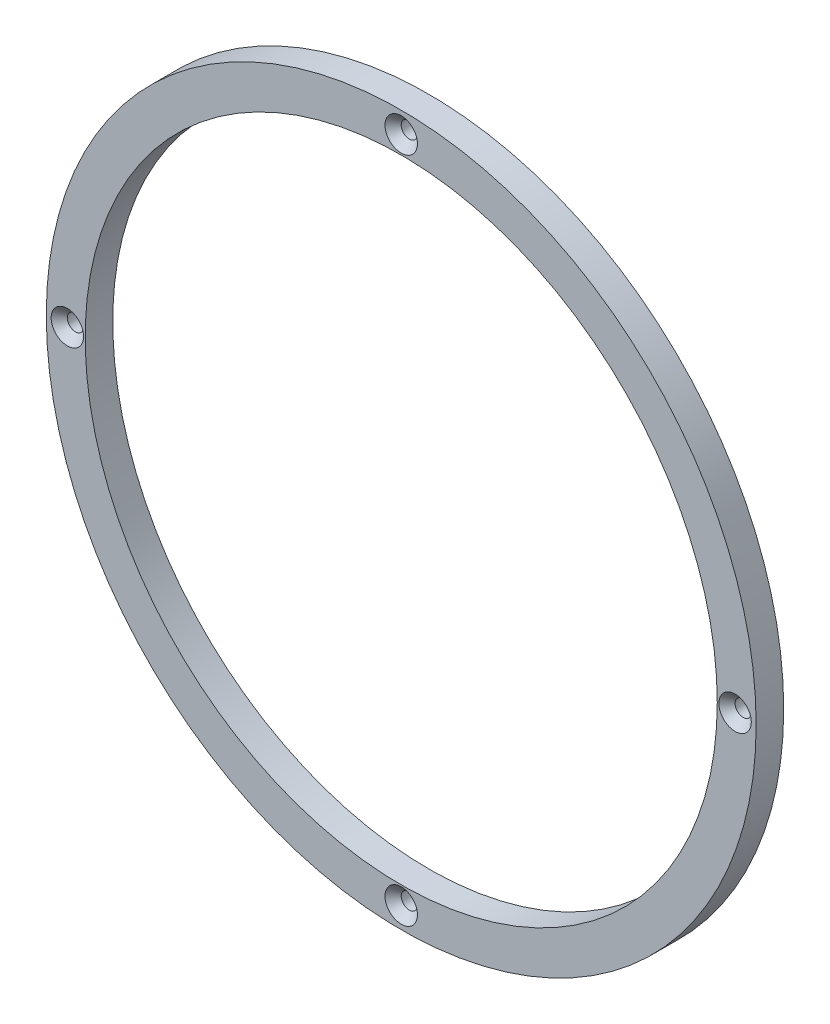
ISO-10303-21;
HEADER;
FILE_DESCRIPTION(('STEP AP214'),'2;1');
FILE_NAME('part.step','',(''),(''),'','','');
FILE_SCHEMA(('AUTOMOTIVE_DESIGN { 1 0 10303 214 1 1 1 1 }'));
ENDSEC;
DATA;
#1=APPLICATION_CONTEXT('core data for automotive mechanical design processes');
#2=APPLICATION_PROTOCOL_DEFINITION('international standard','automotive_design',2000,#1);
#3=PRODUCT_CONTEXT('',#1,'mechanical');
#4=PRODUCT('Part','Part','',(#3));
#5=PRODUCT_RELATED_PRODUCT_CATEGORY('part','',(#4));
#6=PRODUCT_DEFINITION_FORMATION('','',#4);
#7=PRODUCT_DEFINITION_CONTEXT('part definition',#1,'design');
#8=PRODUCT_DEFINITION('design','',#6,#7);
#9=PRODUCT_DEFINITION_SHAPE('','',#8);
#10=(LENGTH_UNIT() NAMED_UNIT(*) SI_UNIT(.MILLI.,.METRE.));
#11=(NAMED_UNIT(*) PLANE_ANGLE_UNIT() SI_UNIT($,.RADIAN.));
#12=(NAMED_UNIT(*) SI_UNIT($,.STERADIAN.) SOLID_ANGLE_UNIT());
#13=UNCERTAINTY_MEASURE_WITH_UNIT(LENGTH_MEASURE(1.E-05),#10,'distance_accuracy_value','');
#14=(GEOMETRIC_REPRESENTATION_CONTEXT(3) GLOBAL_UNCERTAINTY_ASSIGNED_CONTEXT((#13)) GLOBAL_UNIT_ASSIGNED_CONTEXT((#10,
#11,#12)) REPRESENTATION_CONTEXT('',''));
#15=CARTESIAN_POINT('',(0.,0.,0.));
#16=DIRECTION('',(0.,0.,1.));
#17=DIRECTION('',(1.,0.,0.));
#18=AXIS2_PLACEMENT_3D('',#15,#16,#17);
#19=CARTESIAN_POINT('',(0.,0.,8.5));
#20=DIRECTION('',(0.,0.,1.));
#21=DIRECTION('',(1.,0.,0.));
#22=AXIS2_PLACEMENT_3D('',#19,#20,#21);
#23=PLANE('',#22);
#24=CARTESIAN_POINT('',(-103.,1.07886773370253E-12,8.5));
#25=DIRECTION('',(0.,0.,1.));
#26=DIRECTION('',(1.,0.,0.));
#27=AXIS2_PLACEMENT_3D('',#24,#25,#26);
#28=CIRCLE('',#27,5.);
#29=CARTESIAN_POINT('',(-98.,1.07886773370253E-12,8.5));
#30=VERTEX_POINT('',#29);
#31=EDGE_CURVE('E95',#30,#30,#28,.T.);
#32=ORIENTED_EDGE('',*,*,#31,.F.);
#33=EDGE_LOOP('',(#32));
#34=FACE_BOUND('',#33,.T.);
#35=CARTESIAN_POINT('',(0.,-103.,8.5));
#36=DIRECTION('',(0.,0.,1.));
#37=DIRECTION('',(1.,0.,0.));
#38=AXIS2_PLACEMENT_3D('',#35,#36,#37);
#39=CIRCLE('',#38,5.);
#40=CARTESIAN_POINT('',(5.,-103.,8.5));
#41=VERTEX_POINT('',#40);
#42=EDGE_CURVE('E86',#41,#41,#39,.T.);
#43=ORIENTED_EDGE('',*,*,#42,.F.);
#44=EDGE_LOOP('',(#43));
#45=FACE_BOUND('',#44,.T.);
#46=CARTESIAN_POINT('',(103.,-3.59622577900843E-13,8.5));
#47=DIRECTION('',(0.,0.,1.));
#48=DIRECTION('',(1.,0.,0.));
#49=AXIS2_PLACEMENT_3D('',#46,#47,#48);
#50=CIRCLE('',#49,5.);
#51=CARTESIAN_POINT('',(108.,-3.59622577900843E-13,8.5));
#52=VERTEX_POINT('',#51);
#53=EDGE_CURVE('E77',#52,#52,#50,.T.);
#54=ORIENTED_EDGE('',*,*,#53,.F.);
#55=EDGE_LOOP('',(#54));
#56=FACE_BOUND('',#55,.T.);
#57=CARTESIAN_POINT('',(0.,103.,8.5));
#58=DIRECTION('',(0.,0.,1.));
#59=DIRECTION('',(1.,0.,0.));
#60=AXIS2_PLACEMENT_3D('',#57,#58,#59);
#61=CIRCLE('',#60,5.);
#62=CARTESIAN_POINT('',(5.,103.,8.5));
#63=VERTEX_POINT('',#62);
#64=EDGE_CURVE('E68',#63,#63,#61,.T.);
#65=ORIENTED_EDGE('',*,*,#64,.F.);
#66=EDGE_LOOP('',(#65));
#67=FACE_BOUND('',#66,.T.);
#68=CARTESIAN_POINT('',(0.,0.,8.5));
#69=DIRECTION('',(0.,0.,1.));
#70=DIRECTION('',(1.,0.,0.));
#71=AXIS2_PLACEMENT_3D('',#68,#69,#70);
#72=CIRCLE('',#71,109.5);
#73=CARTESIAN_POINT('',(109.5,0.,8.5));
#74=VERTEX_POINT('',#73);
#75=EDGE_CURVE('E11',#74,#74,#72,.T.);
#76=ORIENTED_EDGE('',*,*,#75,.T.);
#77=EDGE_LOOP('',(#76));
#78=FACE_BOUND('',#77,.T.);
#79=CARTESIAN_POINT('',(0.,0.,8.5));
#80=DIRECTION('',(0.,0.,1.));
#81=DIRECTION('',(1.,0.,0.));
#82=AXIS2_PLACEMENT_3D('',#79,#80,#81);
#83=CIRCLE('',#82,97.5);
#84=CARTESIAN_POINT('',(97.5,0.,8.5));
#85=VERTEX_POINT('',#84);
#86=EDGE_CURVE('E55',#85,#85,#83,.T.);
#87=ORIENTED_EDGE('',*,*,#86,.F.);
#88=EDGE_LOOP('',(#87));
#89=FACE_BOUND('',#88,.T.);
#90=ADVANCED_FACE('F44',(#34,#45,#56,#67,#78,#89),#23,.T.);
#91=CARTESIAN_POINT('',(0.,0.,0.));
#92=DIRECTION('',(0.,0.,1.));
#93=DIRECTION('',(1.,0.,0.));
#94=AXIS2_PLACEMENT_3D('',#91,#92,#93);
#95=PLANE('',#94);
#96=CARTESIAN_POINT('',(-103.,1.07886773370253E-12,0.));
#97=DIRECTION('',(0.,0.,1.));
#98=DIRECTION('',(1.,0.,0.));
#99=AXIS2_PLACEMENT_3D('',#96,#97,#98);
#100=CIRCLE('',#99,2.5);
#101=CARTESIAN_POINT('',(-100.5,1.07886773370253E-12,0.));
#102=VERTEX_POINT('',#101);
#103=EDGE_CURVE('E89',#102,#102,#100,.T.);
#104=ORIENTED_EDGE('',*,*,#103,.T.);
#105=EDGE_LOOP('',(#104));
#106=FACE_BOUND('',#105,.T.);
#107=CARTESIAN_POINT('',(0.,-103.,0.));
#108=DIRECTION('',(0.,0.,1.));
#109=DIRECTION('',(1.,0.,0.));
#110=AXIS2_PLACEMENT_3D('',#107,#108,#109);
#111=CIRCLE('',#110,2.5);
#112=CARTESIAN_POINT('',(2.5,-103.,0.));
#113=VERTEX_POINT('',#112);
#114=EDGE_CURVE('E80',#113,#113,#111,.T.);
#115=ORIENTED_EDGE('',*,*,#114,.T.);
#116=EDGE_LOOP('',(#115));
#117=FACE_BOUND('',#116,.T.);
#118=CARTESIAN_POINT('',(103.,-3.59622577900843E-13,0.));
#119=DIRECTION('',(0.,0.,1.));
#120=DIRECTION('',(1.,0.,0.));
#121=AXIS2_PLACEMENT_3D('',#118,#119,#120);
#122=CIRCLE('',#121,2.5);
#123=CARTESIAN_POINT('',(105.5,-3.59622577900843E-13,0.));
#124=VERTEX_POINT('',#123);
#125=EDGE_CURVE('E71',#124,#124,#122,.T.);
#126=ORIENTED_EDGE('',*,*,#125,.T.);
#127=EDGE_LOOP('',(#126));
#128=FACE_BOUND('',#127,.T.);
#129=CARTESIAN_POINT('',(0.,103.,0.));
#130=DIRECTION('',(0.,0.,1.));
#131=DIRECTION('',(1.,0.,0.));
#132=AXIS2_PLACEMENT_3D('',#129,#130,#131);
#133=CIRCLE('',#132,2.5);
#134=CARTESIAN_POINT('',(2.5,103.,0.));
#135=VERTEX_POINT('',#134);
#136=EDGE_CURVE('E60',#135,#135,#133,.T.);
#137=ORIENTED_EDGE('',*,*,#136,.T.);
#138=EDGE_LOOP('',(#137));
#139=FACE_BOUND('',#138,.T.);
#140=CARTESIAN_POINT('',(0.,0.,0.));
#141=DIRECTION('',(0.,0.,1.));
#142=DIRECTION('',(1.,0.,0.));
#143=AXIS2_PLACEMENT_3D('',#140,#141,#142);
#144=CIRCLE('',#143,109.5);
#145=CARTESIAN_POINT('',(109.5,0.,0.));
#146=VERTEX_POINT('',#145);
#147=EDGE_CURVE('E48',#146,#146,#144,.T.);
#148=ORIENTED_EDGE('',*,*,#147,.F.);
#149=EDGE_LOOP('',(#148));
#150=FACE_BOUND('',#149,.T.);
#151=CARTESIAN_POINT('',(0.,0.,0.));
#152=DIRECTION('',(0.,0.,1.));
#153=DIRECTION('',(1.,0.,0.));
#154=AXIS2_PLACEMENT_3D('',#151,#152,#153);
#155=CIRCLE('',#154,97.5);
#156=CARTESIAN_POINT('',(97.5,0.,0.));
#157=VERTEX_POINT('',#156);
#158=EDGE_CURVE('E57',#157,#157,#155,.T.);
#159=ORIENTED_EDGE('',*,*,#158,.T.);
#160=EDGE_LOOP('',(#159));
#161=FACE_BOUND('',#160,.T.);
#162=ADVANCED_FACE('F103',(#106,#117,#128,#139,#150,#161),#95,.F.);
#163=CARTESIAN_POINT('',(0.,0.,8.5));
#164=DIRECTION('',(0.,0.,-1.));
#165=DIRECTION('',(-1.,0.,0.));
#166=AXIS2_PLACEMENT_3D('',#163,#164,#165);
#167=CYLINDRICAL_SURFACE('',#166,109.5);
#168=ORIENTED_EDGE('',*,*,#75,.F.);
#169=EDGE_LOOP('',(#168));
#170=FACE_BOUND('',#169,.T.);
#171=ORIENTED_EDGE('',*,*,#147,.T.);
#172=EDGE_LOOP('',(#171));
#173=FACE_BOUND('',#172,.T.);
#174=ADVANCED_FACE('F46',(#170,#173),#167,.T.);
#175=CARTESIAN_POINT('',(0.,0.,8.5));
#176=DIRECTION('',(0.,0.,-1.));
#177=DIRECTION('',(-1.,0.,0.));
#178=AXIS2_PLACEMENT_3D('',#175,#176,#177);
#179=CYLINDRICAL_SURFACE('',#178,97.5);
#180=ORIENTED_EDGE('',*,*,#86,.T.);
#181=EDGE_LOOP('',(#180));
#182=FACE_BOUND('',#181,.T.);
#183=ORIENTED_EDGE('',*,*,#158,.F.);
#184=EDGE_LOOP('',(#183));
#185=FACE_BOUND('',#184,.T.);
#186=ADVANCED_FACE('F113',(#182,#185),#179,.F.);
#187=CARTESIAN_POINT('',(0.,103.,8.5));
#188=DIRECTION('',(0.,0.,1.));
#189=DIRECTION('',(1.,0.,0.));
#190=AXIS2_PLACEMENT_3D('',#187,#188,#189);
#191=CYLINDRICAL_SURFACE('',#190,2.5);
#192=ORIENTED_EDGE('',*,*,#136,.F.);
#193=EDGE_LOOP('',(#192));
#194=FACE_BOUND('',#193,.T.);
#195=CARTESIAN_POINT('',(0.,103.,6.));
#196=DIRECTION('',(0.,0.,1.));
#197=DIRECTION('',(1.,0.,0.));
#198=AXIS2_PLACEMENT_3D('',#195,#196,#197);
#199=CIRCLE('',#198,2.5);
#200=CARTESIAN_POINT('',(2.5,103.,6.));
#201=VERTEX_POINT('',#200);
#202=EDGE_CURVE('E65',#201,#201,#199,.T.);
#203=ORIENTED_EDGE('',*,*,#202,.T.);
#204=EDGE_LOOP('',(#203));
#205=FACE_BOUND('',#204,.T.);
#206=ADVANCED_FACE('F116',(#194,#205),#191,.F.);
#207=CARTESIAN_POINT('',(0.,103.,8.5));
#208=DIRECTION('',(0.,0.,1.));
#209=DIRECTION('',(1.,0.,0.));
#210=AXIS2_PLACEMENT_3D('',#207,#208,#209);
#211=CONICAL_SURFACE('',#210,5.,0.785398163397449);
#212=ORIENTED_EDGE('',*,*,#202,.F.);
#213=EDGE_LOOP('',(#212));
#214=FACE_BOUND('',#213,.T.);
#215=ORIENTED_EDGE('',*,*,#64,.T.);
#216=EDGE_LOOP('',(#215));
#217=FACE_BOUND('',#216,.T.);
#218=ADVANCED_FACE('F130',(#214,#217),#211,.F.);
#219=CARTESIAN_POINT('',(103.,-3.59622577900843E-13,8.5));
#220=DIRECTION('',(0.,0.,1.));
#221=DIRECTION('',(1.,0.,0.));
#222=AXIS2_PLACEMENT_3D('',#219,#220,#221);
#223=CYLINDRICAL_SURFACE('',#222,2.5);
#224=ORIENTED_EDGE('',*,*,#125,.F.);
#225=EDGE_LOOP('',(#224));
#226=FACE_BOUND('',#225,.T.);
#227=CARTESIAN_POINT('',(103.,-3.59622577900843E-13,6.));
#228=DIRECTION('',(0.,0.,1.));
#229=DIRECTION('',(1.,0.,0.));
#230=AXIS2_PLACEMENT_3D('',#227,#228,#229);
#231=CIRCLE('',#230,2.5);
#232=CARTESIAN_POINT('',(105.5,-3.59622577900843E-13,6.));
#233=VERTEX_POINT('',#232);
#234=EDGE_CURVE('E74',#233,#233,#231,.T.);
#235=ORIENTED_EDGE('',*,*,#234,.T.);
#236=EDGE_LOOP('',(#235));
#237=FACE_BOUND('',#236,.T.);
#238=ADVANCED_FACE('F134',(#226,#237),#223,.F.);
#239=CARTESIAN_POINT('',(103.,-3.59622577900843E-13,8.5));
#240=DIRECTION('',(0.,0.,1.));
#241=DIRECTION('',(1.,0.,0.));
#242=AXIS2_PLACEMENT_3D('',#239,#240,#241);
#243=CONICAL_SURFACE('',#242,5.,0.785398163397449);
#244=ORIENTED_EDGE('',*,*,#234,.F.);
#245=EDGE_LOOP('',(#244));
#246=FACE_BOUND('',#245,.T.);
#247=ORIENTED_EDGE('',*,*,#53,.T.);
#248=EDGE_LOOP('',(#247));
#249=FACE_BOUND('',#248,.T.);
#250=ADVANCED_FACE('F138',(#246,#249),#243,.F.);
#251=CARTESIAN_POINT('',(0.,-103.,8.5));
#252=DIRECTION('',(0.,0.,1.));
#253=DIRECTION('',(1.,0.,0.));
#254=AXIS2_PLACEMENT_3D('',#251,#252,#253);
#255=CYLINDRICAL_SURFACE('',#254,2.5);
#256=ORIENTED_EDGE('',*,*,#114,.F.);
#257=EDGE_LOOP('',(#256));
#258=FACE_BOUND('',#257,.T.);
#259=CARTESIAN_POINT('',(0.,-103.,6.));
#260=DIRECTION('',(0.,0.,1.));
#261=DIRECTION('',(1.,0.,0.));
#262=AXIS2_PLACEMENT_3D('',#259,#260,#261);
#263=CIRCLE('',#262,2.5);
#264=CARTESIAN_POINT('',(2.5,-103.,6.));
#265=VERTEX_POINT('',#264);
#266=EDGE_CURVE('E83',#265,#265,#263,.T.);
#267=ORIENTED_EDGE('',*,*,#266,.T.);
#268=EDGE_LOOP('',(#267));
#269=FACE_BOUND('',#268,.T.);
#270=ADVANCED_FACE('F142',(#258,#269),#255,.F.);
#271=CARTESIAN_POINT('',(0.,-103.,8.5));
#272=DIRECTION('',(0.,0.,1.));
#273=DIRECTION('',(1.,0.,0.));
#274=AXIS2_PLACEMENT_3D('',#271,#272,#273);
#275=CONICAL_SURFACE('',#274,5.,0.785398163397449);
#276=ORIENTED_EDGE('',*,*,#266,.F.);
#277=EDGE_LOOP('',(#276));
#278=FACE_BOUND('',#277,.T.);
#279=ORIENTED_EDGE('',*,*,#42,.T.);
#280=EDGE_LOOP('',(#279));
#281=FACE_BOUND('',#280,.T.);
#282=ADVANCED_FACE('F146',(#278,#281),#275,.F.);
#283=CARTESIAN_POINT('',(-103.,1.07886773370253E-12,8.5));
#284=DIRECTION('',(0.,0.,1.));
#285=DIRECTION('',(1.,0.,0.));
#286=AXIS2_PLACEMENT_3D('',#283,#284,#285);
#287=CYLINDRICAL_SURFACE('',#286,2.5);
#288=ORIENTED_EDGE('',*,*,#103,.F.);
#289=EDGE_LOOP('',(#288));
#290=FACE_BOUND('',#289,.T.);
#291=CARTESIAN_POINT('',(-103.,1.07886773370253E-12,6.));
#292=DIRECTION('',(0.,0.,1.));
#293=DIRECTION('',(1.,0.,0.));
#294=AXIS2_PLACEMENT_3D('',#291,#292,#293);
#295=CIRCLE('',#294,2.5);
#296=CARTESIAN_POINT('',(-100.5,1.07886773370253E-12,6.));
#297=VERTEX_POINT('',#296);
#298=EDGE_CURVE('E92',#297,#297,#295,.T.);
#299=ORIENTED_EDGE('',*,*,#298,.T.);
#300=EDGE_LOOP('',(#299));
#301=FACE_BOUND('',#300,.T.);
#302=ADVANCED_FACE('F150',(#290,#301),#287,.F.);
#303=CARTESIAN_POINT('',(-103.,1.07886773370253E-12,8.5));
#304=DIRECTION('',(0.,0.,1.));
#305=DIRECTION('',(1.,0.,0.));
#306=AXIS2_PLACEMENT_3D('',#303,#304,#305);
#307=CONICAL_SURFACE('',#306,5.,0.785398163397449);
#308=ORIENTED_EDGE('',*,*,#298,.F.);
#309=EDGE_LOOP('',(#308));
#310=FACE_BOUND('',#309,.T.);
#311=ORIENTED_EDGE('',*,*,#31,.T.);
#312=EDGE_LOOP('',(#311));
#313=FACE_BOUND('',#312,.T.);
#314=ADVANCED_FACE('F99',(#310,#313),#307,.F.);
#315=CLOSED_SHELL('',(#90,#162,#174,#186,#206,#218,#238,#250,#270,#282,#302,#314));
#316=MANIFOLD_SOLID_BREP('B2',#315);
#317=ADVANCED_BREP_SHAPE_REPRESENTATION('',(#18,#316),#14);
#318=SHAPE_DEFINITION_REPRESENTATION(#9,#317);
ENDSEC;
END-ISO-10303-21;
